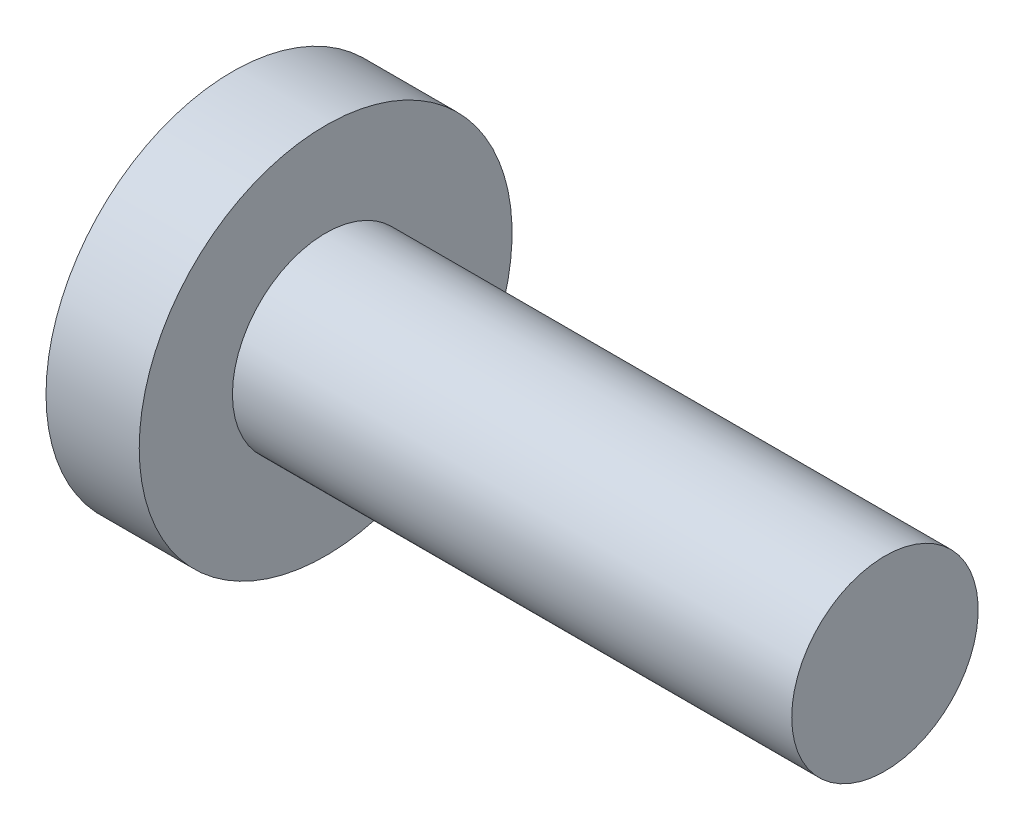
ISO-10303-21;
HEADER;
FILE_DESCRIPTION(('STEP AP214'),'2;1');
FILE_NAME('part.step','',(''),(''),'','','');
FILE_SCHEMA(('AUTOMOTIVE_DESIGN { 1 0 10303 214 1 1 1 1 }'));
ENDSEC;
DATA;
#1=APPLICATION_CONTEXT('core data for automotive mechanical design processes');
#2=APPLICATION_PROTOCOL_DEFINITION('international standard','automotive_design',2000,#1);
#3=PRODUCT_CONTEXT('',#1,'mechanical');
#4=PRODUCT('Part','Part','',(#3));
#5=PRODUCT_RELATED_PRODUCT_CATEGORY('part','',(#4));
#6=PRODUCT_DEFINITION_FORMATION('','',#4);
#7=PRODUCT_DEFINITION_CONTEXT('part definition',#1,'design');
#8=PRODUCT_DEFINITION('design','',#6,#7);
#9=PRODUCT_DEFINITION_SHAPE('','',#8);
#10=(LENGTH_UNIT() NAMED_UNIT(*) SI_UNIT(.MILLI.,.METRE.));
#11=(NAMED_UNIT(*) PLANE_ANGLE_UNIT() SI_UNIT($,.RADIAN.));
#12=(NAMED_UNIT(*) SI_UNIT($,.STERADIAN.) SOLID_ANGLE_UNIT());
#13=UNCERTAINTY_MEASURE_WITH_UNIT(LENGTH_MEASURE(1.E-05),#10,'distance_accuracy_value','');
#14=(GEOMETRIC_REPRESENTATION_CONTEXT(3) GLOBAL_UNCERTAINTY_ASSIGNED_CONTEXT((#13)) GLOBAL_UNIT_ASSIGNED_CONTEXT((#10,
#11,#12)) REPRESENTATION_CONTEXT('',''));
#15=CARTESIAN_POINT('',(0.,0.,0.));
#16=DIRECTION('',(0.,0.,1.));
#17=DIRECTION('',(1.,0.,0.));
#18=AXIS2_PLACEMENT_3D('',#15,#16,#17);
#19=CARTESIAN_POINT('',(0.,0.,0.));
#20=DIRECTION('',(1.,0.,0.));
#21=DIRECTION('',(0.,0.,-1.));
#22=AXIS2_PLACEMENT_3D('',#19,#20,#21);
#23=PLANE('',#22);
#24=CARTESIAN_POINT('',(0.,0.,0.));
#25=DIRECTION('',(-1.,0.,0.));
#26=DIRECTION('',(0.,0.,1.));
#27=AXIS2_PLACEMENT_3D('',#24,#25,#26);
#28=CIRCLE('',#27,10.);
#29=CARTESIAN_POINT('',(0.,0.,10.));
#30=VERTEX_POINT('',#29);
#31=EDGE_CURVE('E10',#30,#30,#28,.T.);
#32=ORIENTED_EDGE('',*,*,#31,.T.);
#33=EDGE_LOOP('',(#32));
#34=FACE_BOUND('',#33,.T.);
#35=ADVANCED_FACE('F37',(#34),#23,.F.);
#36=CARTESIAN_POINT('',(0.,0.,0.));
#37=DIRECTION('',(-1.,0.,0.));
#38=DIRECTION('',(0.,0.,1.));
#39=AXIS2_PLACEMENT_3D('',#36,#37,#38);
#40=CYLINDRICAL_SURFACE('',#39,10.);
#41=ORIENTED_EDGE('',*,*,#31,.F.);
#42=EDGE_LOOP('',(#41));
#43=FACE_BOUND('',#42,.T.);
#44=CARTESIAN_POINT('',(5.,0.,0.));
#45=DIRECTION('',(-1.,0.,0.));
#46=DIRECTION('',(0.,0.,1.));
#47=AXIS2_PLACEMENT_3D('',#44,#45,#46);
#48=CIRCLE('',#47,10.);
#49=CARTESIAN_POINT('',(5.,0.,10.));
#50=VERTEX_POINT('',#49);
#51=EDGE_CURVE('E44',#50,#50,#48,.T.);
#52=ORIENTED_EDGE('',*,*,#51,.T.);
#53=EDGE_LOOP('',(#52));
#54=FACE_BOUND('',#53,.T.);
#55=ADVANCED_FACE('F73',(#43,#54),#40,.T.);
#56=CARTESIAN_POINT('',(5.,10.,0.));
#57=DIRECTION('',(-1.,0.,0.));
#58=DIRECTION('',(0.,0.,1.));
#59=AXIS2_PLACEMENT_3D('',#56,#57,#58);
#60=PLANE('',#59);
#61=ORIENTED_EDGE('',*,*,#51,.F.);
#62=EDGE_LOOP('',(#61));
#63=FACE_BOUND('',#62,.T.);
#64=CARTESIAN_POINT('',(5.,0.,0.));
#65=DIRECTION('',(-1.,0.,0.));
#66=DIRECTION('',(0.,0.,1.));
#67=AXIS2_PLACEMENT_3D('',#64,#65,#66);
#68=CIRCLE('',#67,5.);
#69=CARTESIAN_POINT('',(5.,0.,5.));
#70=VERTEX_POINT('',#69);
#71=EDGE_CURVE('E49',#70,#70,#68,.T.);
#72=ORIENTED_EDGE('',*,*,#71,.T.);
#73=EDGE_LOOP('',(#72));
#74=FACE_BOUND('',#73,.T.);
#75=ADVANCED_FACE('F69',(#63,#74),#60,.F.);
#76=CARTESIAN_POINT('',(0.,0.,0.));
#77=DIRECTION('',(-1.,0.,0.));
#78=DIRECTION('',(0.,0.,1.));
#79=AXIS2_PLACEMENT_3D('',#76,#77,#78);
#80=CYLINDRICAL_SURFACE('',#79,5.);
#81=ORIENTED_EDGE('',*,*,#71,.F.);
#82=EDGE_LOOP('',(#81));
#83=FACE_BOUND('',#82,.T.);
#84=CARTESIAN_POINT('',(35.,0.,0.));
#85=DIRECTION('',(-1.,0.,0.));
#86=DIRECTION('',(0.,0.,1.));
#87=AXIS2_PLACEMENT_3D('',#84,#85,#86);
#88=CIRCLE('',#87,5.);
#89=CARTESIAN_POINT('',(35.,0.,5.));
#90=VERTEX_POINT('',#89);
#91=EDGE_CURVE('E54',#90,#90,#88,.T.);
#92=ORIENTED_EDGE('',*,*,#91,.T.);
#93=EDGE_LOOP('',(#92));
#94=FACE_BOUND('',#93,.T.);
#95=ADVANCED_FACE('F61',(#83,#94),#80,.T.);
#96=CARTESIAN_POINT('',(35.,5.,0.));
#97=DIRECTION('',(-1.,0.,0.));
#98=DIRECTION('',(0.,0.,1.));
#99=AXIS2_PLACEMENT_3D('',#96,#97,#98);
#100=PLANE('',#99);
#101=ORIENTED_EDGE('',*,*,#91,.F.);
#102=EDGE_LOOP('',(#101));
#103=FACE_BOUND('',#102,.T.);
#104=ADVANCED_FACE('F63',(#103),#100,.F.);
#105=CLOSED_SHELL('',(#35,#55,#75,#95,#104));
#106=MANIFOLD_SOLID_BREP('B2',#105);
#107=ADVANCED_BREP_SHAPE_REPRESENTATION('',(#18,#106),#14);
#108=SHAPE_DEFINITION_REPRESENTATION(#9,#107);
ENDSEC;
END-ISO-10303-21;
